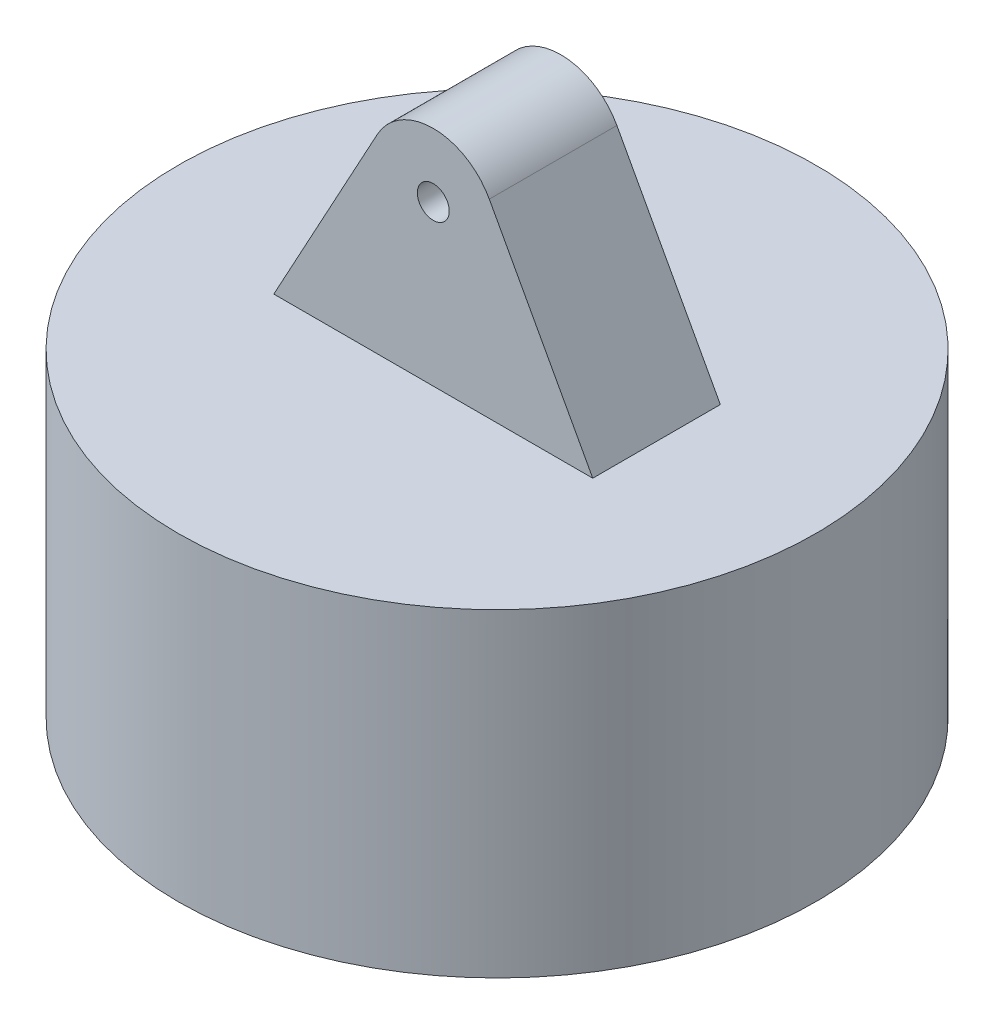
ISO-10303-21;
HEADER;
FILE_DESCRIPTION(('STEP AP214'),'2;1');
FILE_NAME('part.step','',(''),(''),'','','');
FILE_SCHEMA(('AUTOMOTIVE_DESIGN { 1 0 10303 214 1 1 1 1 }'));
ENDSEC;
DATA;
#1=APPLICATION_CONTEXT('core data for automotive mechanical design processes');
#2=APPLICATION_PROTOCOL_DEFINITION('international standard','automotive_design',2000,#1);
#3=PRODUCT_CONTEXT('',#1,'mechanical');
#4=PRODUCT('Part','Part','',(#3));
#5=PRODUCT_RELATED_PRODUCT_CATEGORY('part','',(#4));
#6=PRODUCT_DEFINITION_FORMATION('','',#4);
#7=PRODUCT_DEFINITION_CONTEXT('part definition',#1,'design');
#8=PRODUCT_DEFINITION('design','',#6,#7);
#9=PRODUCT_DEFINITION_SHAPE('','',#8);
#10=(LENGTH_UNIT() NAMED_UNIT(*) SI_UNIT(.MILLI.,.METRE.));
#11=(NAMED_UNIT(*) PLANE_ANGLE_UNIT() SI_UNIT($,.RADIAN.));
#12=(NAMED_UNIT(*) SI_UNIT($,.STERADIAN.) SOLID_ANGLE_UNIT());
#13=UNCERTAINTY_MEASURE_WITH_UNIT(LENGTH_MEASURE(1.E-05),#10,'distance_accuracy_value','');
#14=(GEOMETRIC_REPRESENTATION_CONTEXT(3) GLOBAL_UNCERTAINTY_ASSIGNED_CONTEXT((#13)) GLOBAL_UNIT_ASSIGNED_CONTEXT((#10,
#11,#12)) REPRESENTATION_CONTEXT('',''));
#15=CARTESIAN_POINT('',(0.,0.,0.));
#16=DIRECTION('',(0.,0.,1.));
#17=DIRECTION('',(1.,0.,0.));
#18=AXIS2_PLACEMENT_3D('',#15,#16,#17);
#19=CARTESIAN_POINT('',(12.7,12.7,0.));
#20=DIRECTION('',(0.,-1.,0.));
#21=DIRECTION('',(0.,0.,-1.));
#22=AXIS2_PLACEMENT_3D('',#19,#20,#21);
#23=PLANE('',#22);
#24=CARTESIAN_POINT('',(0.,12.7,0.));
#25=DIRECTION('',(0.,1.,0.));
#26=DIRECTION('',(0.,0.,1.));
#27=AXIS2_PLACEMENT_3D('',#24,#25,#26);
#28=CIRCLE('',#27,12.7);
#29=CARTESIAN_POINT('',(0.,12.7,12.7));
#30=VERTEX_POINT('',#29);
#31=EDGE_CURVE('E11',#30,#30,#28,.T.);
#32=ORIENTED_EDGE('',*,*,#31,.T.);
#33=EDGE_LOOP('',(#32));
#34=FACE_BOUND('',#33,.T.);
#35=DIRECTION('',(0.,0.,-1.));
#36=VECTOR('',#35,1.);
#37=CARTESIAN_POINT('',(-6.35,12.7,2.54));
#38=LINE('',#37,#36);
#39=CARTESIAN_POINT('',(-6.35,12.7,2.54));
#40=VERTEX_POINT('',#39);
#41=CARTESIAN_POINT('',(-6.35,12.7,-2.54));
#42=VERTEX_POINT('',#41);
#43=EDGE_CURVE('E53',#40,#42,#38,.T.);
#44=ORIENTED_EDGE('',*,*,#43,.T.);
#45=DIRECTION('',(1.,0.,0.));
#46=VECTOR('',#45,1.);
#47=CARTESIAN_POINT('',(-6.35,12.7,-2.54));
#48=LINE('',#47,#46);
#49=CARTESIAN_POINT('',(6.35,12.7,-2.54));
#50=VERTEX_POINT('',#49);
#51=EDGE_CURVE('E159',#42,#50,#48,.T.);
#52=ORIENTED_EDGE('',*,*,#51,.T.);
#53=DIRECTION('',(0.,0.,-1.));
#54=VECTOR('',#53,1.);
#55=CARTESIAN_POINT('',(6.35,12.7,2.54));
#56=LINE('',#55,#54);
#57=CARTESIAN_POINT('',(6.35,12.7,2.54));
#58=VERTEX_POINT('',#57);
#59=EDGE_CURVE('E98',#58,#50,#56,.T.);
#60=ORIENTED_EDGE('',*,*,#59,.F.);
#61=DIRECTION('',(1.,0.,0.));
#62=VECTOR('',#61,1.);
#63=CARTESIAN_POINT('',(-6.35,12.7,2.54));
#64=LINE('',#63,#62);
#65=EDGE_CURVE('E48',#40,#58,#64,.T.);
#66=ORIENTED_EDGE('',*,*,#65,.F.);
#67=EDGE_LOOP('',(#44,#52,#60,#66));
#68=FACE_BOUND('',#67,.T.);
#69=ADVANCED_FACE('F33',(#34,#68),#23,.F.);
#70=CARTESIAN_POINT('',(0.,0.,0.));
#71=DIRECTION('',(0.,1.,0.));
#72=DIRECTION('',(-1.,0.,0.));
#73=AXIS2_PLACEMENT_3D('',#70,#71,#72);
#74=SPHERICAL_SURFACE('',#73,7.493);
#75=CARTESIAN_POINT('',(0.,0.,0.));
#76=DIRECTION('',(0.,1.,0.));
#77=DIRECTION('',(0.,0.,1.));
#78=AXIS2_PLACEMENT_3D('',#75,#76,#77);
#79=CIRCLE('',#78,7.493);
#80=CARTESIAN_POINT('',(0.,0.,7.493));
#81=VERTEX_POINT('',#80);
#82=EDGE_CURVE('E94',#81,#81,#79,.T.);
#83=ORIENTED_EDGE('',*,*,#82,.F.);
#84=EDGE_LOOP('',(#83));
#85=FACE_BOUND('',#84,.T.);
#86=ADVANCED_FACE('F35',(#85),#74,.F.);
#87=CARTESIAN_POINT('',(0.,12.7,0.));
#88=DIRECTION('',(0.,1.,0.));
#89=DIRECTION('',(0.,0.,1.));
#90=AXIS2_PLACEMENT_3D('',#87,#88,#89);
#91=CYLINDRICAL_SURFACE('',#90,12.7);
#92=ORIENTED_EDGE('',*,*,#31,.F.);
#93=EDGE_LOOP('',(#92));
#94=FACE_BOUND('',#93,.T.);
#95=CARTESIAN_POINT('',(0.,0.,0.));
#96=DIRECTION('',(0.,1.,0.));
#97=DIRECTION('',(0.,0.,1.));
#98=AXIS2_PLACEMENT_3D('',#95,#96,#97);
#99=CIRCLE('',#98,12.7);
#100=CARTESIAN_POINT('',(0.,0.,12.7));
#101=VERTEX_POINT('',#100);
#102=EDGE_CURVE('E41',#101,#101,#99,.T.);
#103=ORIENTED_EDGE('',*,*,#102,.T.);
#104=EDGE_LOOP('',(#103));
#105=FACE_BOUND('',#104,.T.);
#106=ADVANCED_FACE('F104',(#94,#105),#91,.T.);
#107=CARTESIAN_POINT('',(7.493,0.,0.));
#108=DIRECTION('',(0.,1.,0.));
#109=DIRECTION('',(0.,0.,1.));
#110=AXIS2_PLACEMENT_3D('',#107,#108,#109);
#111=PLANE('',#110);
#112=ORIENTED_EDGE('',*,*,#102,.F.);
#113=EDGE_LOOP('',(#112));
#114=FACE_BOUND('',#113,.T.);
#115=ORIENTED_EDGE('',*,*,#82,.T.);
#116=EDGE_LOOP('',(#115));
#117=FACE_BOUND('',#116,.T.);
#118=ADVANCED_FACE('F106',(#114,#117),#111,.F.);
#119=CARTESIAN_POINT('',(0.,19.05,2.54));
#120=DIRECTION('',(0.,0.,-1.));
#121=DIRECTION('',(-1.,0.,0.));
#122=AXIS2_PLACEMENT_3D('',#119,#120,#121);
#123=PLANE('',#122);
#124=CARTESIAN_POINT('',(0.,19.05,2.54));
#125=DIRECTION('',(0.,0.,1.));
#126=DIRECTION('',(-1.,0.,0.));
#127=AXIS2_PLACEMENT_3D('',#124,#125,#126);
#128=CIRCLE('',#127,2.54);
#129=CARTESIAN_POINT('',(2.23071181571382,20.2647118157138,2.54));
#130=VERTEX_POINT('',#129);
#131=CARTESIAN_POINT('',(-2.23071181571382,20.2647118157138,2.54));
#132=VERTEX_POINT('',#131);
#133=EDGE_CURVE('E79',#130,#132,#128,.T.);
#134=ORIENTED_EDGE('',*,*,#133,.T.);
#135=DIRECTION('',(-0.478232998312527,-0.878232998312527,0.));
#136=VECTOR('',#135,1.);
#137=CARTESIAN_POINT('',(-2.23071181571382,20.2647118157138,2.54));
#138=LINE('',#137,#136);
#139=EDGE_CURVE('E72',#132,#40,#138,.T.);
#140=ORIENTED_EDGE('',*,*,#139,.T.);
#141=ORIENTED_EDGE('',*,*,#65,.T.);
#142=DIRECTION('',(-0.478232998312527,0.878232998312527,0.));
#143=VECTOR('',#142,1.);
#144=CARTESIAN_POINT('',(2.23071181571382,20.2647118157138,2.54));
#145=LINE('',#144,#143);
#146=EDGE_CURVE('E85',#58,#130,#145,.T.);
#147=ORIENTED_EDGE('',*,*,#146,.T.);
#148=EDGE_LOOP('',(#134,#140,#141,#147));
#149=FACE_BOUND('',#148,.T.);
#150=CARTESIAN_POINT('',(0.,19.05,2.54));
#151=DIRECTION('',(0.,0.,1.));
#152=DIRECTION('',(1.,0.,0.));
#153=AXIS2_PLACEMENT_3D('',#150,#151,#152);
#154=CIRCLE('',#153,0.634999999999999);
#155=CARTESIAN_POINT('',(0.634999999999998,19.05,2.54));
#156=VERTEX_POINT('',#155);
#157=EDGE_CURVE('E145',#156,#156,#154,.T.);
#158=ORIENTED_EDGE('',*,*,#157,.F.);
#159=EDGE_LOOP('',(#158));
#160=FACE_BOUND('',#159,.T.);
#161=ADVANCED_FACE('F82',(#149,#160),#123,.F.);
#162=CARTESIAN_POINT('',(0.,19.05,-2.54));
#163=DIRECTION('',(0.,0.,-1.));
#164=DIRECTION('',(-1.,0.,0.));
#165=AXIS2_PLACEMENT_3D('',#162,#163,#164);
#166=PLANE('',#165);
#167=CARTESIAN_POINT('',(0.,19.05,-2.54));
#168=DIRECTION('',(0.,0.,1.));
#169=DIRECTION('',(-1.,0.,0.));
#170=AXIS2_PLACEMENT_3D('',#167,#168,#169);
#171=CIRCLE('',#170,2.54);
#172=CARTESIAN_POINT('',(2.23071181571382,20.2647118157138,-2.54));
#173=VERTEX_POINT('',#172);
#174=CARTESIAN_POINT('',(-2.23071181571382,20.2647118157138,-2.54));
#175=VERTEX_POINT('',#174);
#176=EDGE_CURVE('E93',#173,#175,#171,.T.);
#177=ORIENTED_EDGE('',*,*,#176,.F.);
#178=DIRECTION('',(-0.478232998312527,0.878232998312527,0.));
#179=VECTOR('',#178,1.);
#180=CARTESIAN_POINT('',(2.23071181571382,20.2647118157138,-2.54));
#181=LINE('',#180,#179);
#182=EDGE_CURVE('E89',#50,#173,#181,.T.);
#183=ORIENTED_EDGE('',*,*,#182,.F.);
#184=ORIENTED_EDGE('',*,*,#51,.F.);
#185=DIRECTION('',(-0.478232998312527,-0.878232998312527,0.));
#186=VECTOR('',#185,1.);
#187=CARTESIAN_POINT('',(-2.23071181571382,20.2647118157138,-2.54));
#188=LINE('',#187,#186);
#189=EDGE_CURVE('E157',#175,#42,#188,.T.);
#190=ORIENTED_EDGE('',*,*,#189,.F.);
#191=EDGE_LOOP('',(#177,#183,#184,#190));
#192=FACE_BOUND('',#191,.T.);
#193=CARTESIAN_POINT('',(0.,19.05,-2.54));
#194=DIRECTION('',(0.,0.,1.));
#195=DIRECTION('',(1.,0.,0.));
#196=AXIS2_PLACEMENT_3D('',#193,#194,#195);
#197=CIRCLE('',#196,0.634999999999999);
#198=CARTESIAN_POINT('',(0.634999999999998,19.05,-2.54));
#199=VERTEX_POINT('',#198);
#200=EDGE_CURVE('E148',#199,#199,#197,.T.);
#201=ORIENTED_EDGE('',*,*,#200,.T.);
#202=EDGE_LOOP('',(#201));
#203=FACE_BOUND('',#202,.T.);
#204=ADVANCED_FACE('F125',(#192,#203),#166,.T.);
#205=CARTESIAN_POINT('',(0.,19.05,2.54));
#206=DIRECTION('',(0.,0.,-1.));
#207=DIRECTION('',(-1.,0.,0.));
#208=AXIS2_PLACEMENT_3D('',#205,#206,#207);
#209=CYLINDRICAL_SURFACE('',#208,2.54);
#210=ORIENTED_EDGE('',*,*,#176,.T.);
#211=DIRECTION('',(0.,0.,-1.));
#212=VECTOR('',#211,1.);
#213=CARTESIAN_POINT('',(-2.23071181571382,20.2647118157138,2.54));
#214=LINE('',#213,#212);
#215=EDGE_CURVE('E76',#132,#175,#214,.T.);
#216=ORIENTED_EDGE('',*,*,#215,.F.);
#217=ORIENTED_EDGE('',*,*,#133,.F.);
#218=DIRECTION('',(0.,0.,-1.));
#219=VECTOR('',#218,1.);
#220=CARTESIAN_POINT('',(2.23071181571382,20.2647118157138,2.54));
#221=LINE('',#220,#219);
#222=EDGE_CURVE('E155',#130,#173,#221,.T.);
#223=ORIENTED_EDGE('',*,*,#222,.T.);
#224=EDGE_LOOP('',(#210,#216,#217,#223));
#225=FACE_BOUND('',#224,.T.);
#226=ADVANCED_FACE('F91',(#225),#209,.T.);
#227=CARTESIAN_POINT('',(-2.23071181571382,20.2647118157138,2.54));
#228=DIRECTION('',(0.878232998312527,-0.478232998312527,0.));
#229=DIRECTION('',(0.478232998312527,0.878232998312527,0.));
#230=AXIS2_PLACEMENT_3D('',#227,#228,#229);
#231=PLANE('',#230);
#232=ORIENTED_EDGE('',*,*,#189,.T.);
#233=ORIENTED_EDGE('',*,*,#43,.F.);
#234=ORIENTED_EDGE('',*,*,#139,.F.);
#235=ORIENTED_EDGE('',*,*,#215,.T.);
#236=EDGE_LOOP('',(#232,#233,#234,#235));
#237=FACE_BOUND('',#236,.T.);
#238=ADVANCED_FACE('F74',(#237),#231,.F.);
#239=CARTESIAN_POINT('',(2.23071181571382,20.2647118157138,2.54));
#240=DIRECTION('',(-0.878232998312527,-0.478232998312527,0.));
#241=DIRECTION('',(0.478232998312527,-0.878232998312527,0.));
#242=AXIS2_PLACEMENT_3D('',#239,#240,#241);
#243=PLANE('',#242);
#244=ORIENTED_EDGE('',*,*,#182,.T.);
#245=ORIENTED_EDGE('',*,*,#222,.F.);
#246=ORIENTED_EDGE('',*,*,#146,.F.);
#247=ORIENTED_EDGE('',*,*,#59,.T.);
#248=EDGE_LOOP('',(#244,#245,#246,#247));
#249=FACE_BOUND('',#248,.T.);
#250=ADVANCED_FACE('F128',(#249),#243,.F.);
#251=CARTESIAN_POINT('',(0.,19.05,2.54));
#252=DIRECTION('',(0.,0.,-1.));
#253=DIRECTION('',(-1.,0.,0.));
#254=AXIS2_PLACEMENT_3D('',#251,#252,#253);
#255=CYLINDRICAL_SURFACE('',#254,0.634999999999999);
#256=ORIENTED_EDGE('',*,*,#157,.T.);
#257=EDGE_LOOP('',(#256));
#258=FACE_BOUND('',#257,.T.);
#259=ORIENTED_EDGE('',*,*,#200,.F.);
#260=EDGE_LOOP('',(#259));
#261=FACE_BOUND('',#260,.T.);
#262=ADVANCED_FACE('F131',(#258,#261),#255,.F.);
#263=CLOSED_SHELL('',(#69,#86,#106,#118,#161,#204,#226,#238,#250,#262));
#264=MANIFOLD_SOLID_BREP('B2',#263);
#265=ADVANCED_BREP_SHAPE_REPRESENTATION('',(#18,#264),#14);
#266=SHAPE_DEFINITION_REPRESENTATION(#9,#265);
ENDSEC;
END-ISO-10303-21;
